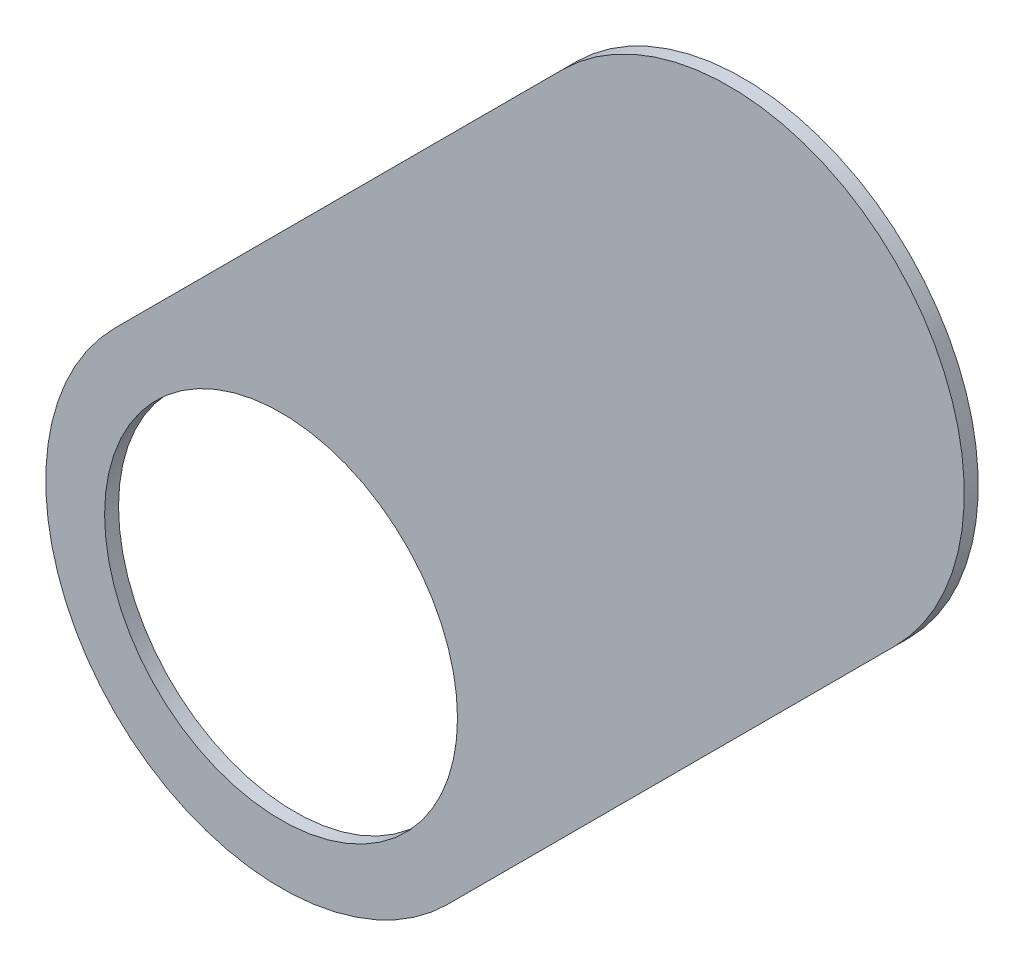
ISO-10303-21;
HEADER;
FILE_DESCRIPTION(('STEP AP214'),'2;1');
FILE_NAME('part.step','',(''),(''),'','','');
FILE_SCHEMA(('AUTOMOTIVE_DESIGN { 1 0 10303 214 1 1 1 1 }'));
ENDSEC;
DATA;
#1=APPLICATION_CONTEXT('core data for automotive mechanical design processes');
#2=APPLICATION_PROTOCOL_DEFINITION('international standard','automotive_design',2000,#1);
#3=PRODUCT_CONTEXT('',#1,'mechanical');
#4=PRODUCT('Part','Part','',(#3));
#5=PRODUCT_RELATED_PRODUCT_CATEGORY('part','',(#4));
#6=PRODUCT_DEFINITION_FORMATION('','',#4);
#7=PRODUCT_DEFINITION_CONTEXT('part definition',#1,'design');
#8=PRODUCT_DEFINITION('design','',#6,#7);
#9=PRODUCT_DEFINITION_SHAPE('','',#8);
#10=(LENGTH_UNIT() NAMED_UNIT(*) SI_UNIT(.MILLI.,.METRE.));
#11=(NAMED_UNIT(*) PLANE_ANGLE_UNIT() SI_UNIT($,.RADIAN.));
#12=(NAMED_UNIT(*) SI_UNIT($,.STERADIAN.) SOLID_ANGLE_UNIT());
#13=UNCERTAINTY_MEASURE_WITH_UNIT(LENGTH_MEASURE(1.E-05),#10,'distance_accuracy_value','');
#14=(GEOMETRIC_REPRESENTATION_CONTEXT(3) GLOBAL_UNCERTAINTY_ASSIGNED_CONTEXT((#13)) GLOBAL_UNIT_ASSIGNED_CONTEXT((#10,
#11,#12)) REPRESENTATION_CONTEXT('',''));
#15=CARTESIAN_POINT('',(0.,0.,0.));
#16=DIRECTION('',(0.,0.,1.));
#17=DIRECTION('',(1.,0.,0.));
#18=AXIS2_PLACEMENT_3D('',#15,#16,#17);
#19=CARTESIAN_POINT('',(106.82425422,45.57574578,0.));
#20=DIRECTION('',(-0.707106781186552,0.707106781186543,0.));
#21=DIRECTION('',(0.707106781186543,0.707106781186552,0.));
#22=AXIS2_PLACEMENT_3D('',#19,#20,#21);
#23=PLANE('',#22);
#24=DIRECTION('',(0.707106781186543,0.707106781186552,0.));
#25=VECTOR('',#24,1.);
#26=CARTESIAN_POINT('',(106.82425422,45.57574578,0.03556));
#27=LINE('',#26,#25);
#28=CARTESIAN_POINT('',(106.82425422,45.57574578,0.03556));
#29=VERTEX_POINT('',#28);
#30=CARTESIAN_POINT('',(107.96664462,46.71813618,0.03556));
#31=VERTEX_POINT('',#30);
#32=EDGE_CURVE('E11',#29,#31,#27,.T.);
#33=ORIENTED_EDGE('',*,*,#32,.F.);
#34=DIRECTION('',(0.,0.,1.));
#35=VECTOR('',#34,1.);
#36=CARTESIAN_POINT('',(106.82425422,45.57574578,0.));
#37=LINE('',#36,#35);
#38=CARTESIAN_POINT('',(106.82425422,45.57574578,0.));
#39=VERTEX_POINT('',#38);
#40=EDGE_CURVE('E24',#39,#29,#37,.T.);
#41=ORIENTED_EDGE('',*,*,#40,.F.);
#42=DIRECTION('',(0.707106781186543,0.707106781186552,0.));
#43=VECTOR('',#42,1.);
#44=CARTESIAN_POINT('',(106.82425422,45.57574578,0.));
#45=LINE('',#44,#43);
#46=CARTESIAN_POINT('',(107.96664462,46.71813618,0.));
#47=VERTEX_POINT('',#46);
#48=EDGE_CURVE('E96',#39,#47,#45,.T.);
#49=ORIENTED_EDGE('',*,*,#48,.T.);
#50=DIRECTION('',(0.,0.,1.));
#51=VECTOR('',#50,1.);
#52=CARTESIAN_POINT('',(107.96664462,46.71813618,0.));
#53=LINE('',#52,#51);
#54=EDGE_CURVE('E37',#47,#31,#53,.T.);
#55=ORIENTED_EDGE('',*,*,#54,.T.);
#56=EDGE_LOOP('',(#33,#41,#49,#55));
#57=FACE_BOUND('',#56,.T.);
#58=ADVANCED_FACE('F17',(#57),#23,.F.);
#59=CARTESIAN_POINT('',(106.3999904,46.0000096,0.));
#60=DIRECTION('',(0.,0.,-1.));
#61=DIRECTION('',(-0.707106781186554,0.707106781186542,0.));
#62=AXIS2_PLACEMENT_3D('',#59,#60,#61);
#63=CYLINDRICAL_SURFACE('',#62,0.599999648268219);
#64=CARTESIAN_POINT('',(106.3999904,46.0000096,0.03556));
#65=DIRECTION('',(0.,0.,1.));
#66=DIRECTION('',(-0.707106781186554,0.707106781186542,0.));
#67=AXIS2_PLACEMENT_3D('',#64,#65,#66);
#68=CIRCLE('',#67,0.599999648268219);
#69=CARTESIAN_POINT('',(105.97572658,46.42427342,0.03556));
#70=VERTEX_POINT('',#69);
#71=EDGE_CURVE('E92',#70,#29,#68,.T.);
#72=ORIENTED_EDGE('',*,*,#71,.F.);
#73=DIRECTION('',(0.,0.,1.));
#74=VECTOR('',#73,1.);
#75=CARTESIAN_POINT('',(105.97572658,46.42427342,0.));
#76=LINE('',#75,#74);
#77=CARTESIAN_POINT('',(105.97572658,46.42427342,0.));
#78=VERTEX_POINT('',#77);
#79=EDGE_CURVE('E90',#78,#70,#76,.T.);
#80=ORIENTED_EDGE('',*,*,#79,.F.);
#81=CARTESIAN_POINT('',(106.3999904,46.0000096,0.));
#82=DIRECTION('',(0.,0.,1.));
#83=DIRECTION('',(-0.707106781186554,0.707106781186542,0.));
#84=AXIS2_PLACEMENT_3D('',#81,#82,#83);
#85=CIRCLE('',#84,0.599999648268219);
#86=EDGE_CURVE('E88',#78,#39,#85,.T.);
#87=ORIENTED_EDGE('',*,*,#86,.T.);
#88=ORIENTED_EDGE('',*,*,#40,.T.);
#89=EDGE_LOOP('',(#72,#80,#87,#88));
#90=FACE_BOUND('',#89,.T.);
#91=ADVANCED_FACE('F111',(#90),#63,.T.);
#92=CARTESIAN_POINT('',(107.5423808,47.1424,0.));
#93=DIRECTION('',(0.,0.,-1.));
#94=DIRECTION('',(0.707106781186542,-0.707106781186554,0.));
#95=AXIS2_PLACEMENT_3D('',#92,#93,#94);
#96=CYLINDRICAL_SURFACE('',#95,0.599999648268213);
#97=CARTESIAN_POINT('',(107.5423808,47.1424,0.03556));
#98=DIRECTION('',(0.,0.,1.));
#99=DIRECTION('',(0.707106781186542,-0.707106781186554,0.));
#100=AXIS2_PLACEMENT_3D('',#97,#98,#99);
#101=CIRCLE('',#100,0.599999648268213);
#102=CARTESIAN_POINT('',(107.11811698,47.56666382,0.03556));
#103=VERTEX_POINT('',#102);
#104=EDGE_CURVE('E85',#31,#103,#101,.T.);
#105=ORIENTED_EDGE('',*,*,#104,.F.);
#106=ORIENTED_EDGE('',*,*,#54,.F.);
#107=CARTESIAN_POINT('',(107.5423808,47.1424,0.));
#108=DIRECTION('',(0.,0.,1.));
#109=DIRECTION('',(0.707106781186542,-0.707106781186554,0.));
#110=AXIS2_PLACEMENT_3D('',#107,#108,#109);
#111=CIRCLE('',#110,0.599999648268213);
#112=CARTESIAN_POINT('',(107.11811698,47.56666382,0.));
#113=VERTEX_POINT('',#112);
#114=EDGE_CURVE('E82',#47,#113,#111,.T.);
#115=ORIENTED_EDGE('',*,*,#114,.T.);
#116=DIRECTION('',(0.,0.,1.));
#117=VECTOR('',#116,1.);
#118=CARTESIAN_POINT('',(107.11811698,47.56666382,0.));
#119=LINE('',#118,#117);
#120=EDGE_CURVE('E80',#113,#103,#119,.T.);
#121=ORIENTED_EDGE('',*,*,#120,.T.);
#122=EDGE_LOOP('',(#105,#106,#115,#121));
#123=FACE_BOUND('',#122,.T.);
#124=ADVANCED_FACE('F104',(#123),#96,.T.);
#125=CARTESIAN_POINT('',(107.11811698,47.56666382,0.));
#126=DIRECTION('',(0.707106781186548,-0.707106781186548,0.));
#127=DIRECTION('',(-0.707106781186548,-0.707106781186548,0.));
#128=AXIS2_PLACEMENT_3D('',#125,#126,#127);
#129=PLANE('',#128);
#130=DIRECTION('',(-0.707106781186548,-0.707106781186548,0.));
#131=VECTOR('',#130,1.);
#132=CARTESIAN_POINT('',(107.11811698,47.56666382,0.03556));
#133=LINE('',#132,#131);
#134=EDGE_CURVE('E77',#103,#70,#133,.T.);
#135=ORIENTED_EDGE('',*,*,#134,.F.);
#136=ORIENTED_EDGE('',*,*,#120,.F.);
#137=DIRECTION('',(-0.707106781186548,-0.707106781186548,0.));
#138=VECTOR('',#137,1.);
#139=CARTESIAN_POINT('',(107.11811698,47.56666382,0.));
#140=LINE('',#139,#138);
#141=EDGE_CURVE('E68',#113,#78,#140,.T.);
#142=ORIENTED_EDGE('',*,*,#141,.T.);
#143=ORIENTED_EDGE('',*,*,#79,.T.);
#144=EDGE_LOOP('',(#135,#136,#142,#143));
#145=FACE_BOUND('',#144,.T.);
#146=ADVANCED_FACE('F110',(#145),#129,.F.);
#147=CARTESIAN_POINT('',(106.3999904,46.0000096,0.));
#148=DIRECTION('',(0.,0.,-1.));
#149=DIRECTION('',(1.,0.,0.));
#150=AXIS2_PLACEMENT_3D('',#147,#148,#149);
#151=CYLINDRICAL_SURFACE('',#150,0.4499991);
#152=DIRECTION('',(0.,0.,1.));
#153=VECTOR('',#152,1.);
#154=CARTESIAN_POINT('',(106.8499895,46.0000096,0.));
#155=LINE('',#154,#153);
#156=CARTESIAN_POINT('',(106.8499895,46.0000096,0.));
#157=VERTEX_POINT('',#156);
#158=CARTESIAN_POINT('',(106.8499895,46.0000096,0.03556));
#159=VERTEX_POINT('',#158);
#160=EDGE_CURVE('E62',#157,#159,#155,.T.);
#161=ORIENTED_EDGE('',*,*,#160,.T.);
#162=CARTESIAN_POINT('',(106.3999904,46.0000096,0.03556));
#163=DIRECTION('',(0.,0.,1.));
#164=DIRECTION('',(1.,0.,0.));
#165=AXIS2_PLACEMENT_3D('',#162,#163,#164);
#166=CIRCLE('',#165,0.4499991);
#167=EDGE_CURVE('E67',#159,#159,#166,.T.);
#168=ORIENTED_EDGE('',*,*,#167,.T.);
#169=ORIENTED_EDGE('',*,*,#160,.F.);
#170=CARTESIAN_POINT('',(106.3999904,46.0000096,0.));
#171=DIRECTION('',(0.,0.,1.));
#172=DIRECTION('',(1.,0.,0.));
#173=AXIS2_PLACEMENT_3D('',#170,#171,#172);
#174=CIRCLE('',#173,0.4499991);
#175=EDGE_CURVE('E65',#157,#157,#174,.T.);
#176=ORIENTED_EDGE('',*,*,#175,.F.);
#177=EDGE_LOOP('',(#161,#168,#169,#176));
#178=FACE_BOUND('',#177,.T.);
#179=ADVANCED_FACE('F64',(#178),#151,.F.);
#180=CARTESIAN_POINT('',(106.82425422,45.57574578,0.));
#181=DIRECTION('',(0.,0.,-1.));
#182=DIRECTION('',(-1.,0.,0.));
#183=AXIS2_PLACEMENT_3D('',#180,#181,#182);
#184=PLANE('',#183);
#185=ORIENTED_EDGE('',*,*,#48,.F.);
#186=ORIENTED_EDGE('',*,*,#86,.F.);
#187=ORIENTED_EDGE('',*,*,#141,.F.);
#188=ORIENTED_EDGE('',*,*,#114,.F.);
#189=EDGE_LOOP('',(#185,#186,#187,#188));
#190=FACE_BOUND('',#189,.T.);
#191=ORIENTED_EDGE('',*,*,#175,.T.);
#192=EDGE_LOOP('',(#191));
#193=FACE_BOUND('',#192,.T.);
#194=ADVANCED_FACE('F71',(#190,#193),#184,.T.);
#195=CARTESIAN_POINT('',(106.82425422,45.57574578,0.03556));
#196=DIRECTION('',(0.,0.,-1.));
#197=DIRECTION('',(-1.,0.,0.));
#198=AXIS2_PLACEMENT_3D('',#195,#196,#197);
#199=PLANE('',#198);
#200=ORIENTED_EDGE('',*,*,#134,.T.);
#201=ORIENTED_EDGE('',*,*,#71,.T.);
#202=ORIENTED_EDGE('',*,*,#32,.T.);
#203=ORIENTED_EDGE('',*,*,#104,.T.);
#204=EDGE_LOOP('',(#200,#201,#202,#203));
#205=FACE_BOUND('',#204,.T.);
#206=ORIENTED_EDGE('',*,*,#167,.F.);
#207=EDGE_LOOP('',(#206));
#208=FACE_BOUND('',#207,.T.);
#209=ADVANCED_FACE('F107',(#205,#208),#199,.F.);
#210=CLOSED_SHELL('',(#58,#91,#124,#146,#179,#194,#209));
#211=MANIFOLD_SOLID_BREP('B1',#210);
#212=ADVANCED_BREP_SHAPE_REPRESENTATION('',(#18,#211),#14);
#213=SHAPE_DEFINITION_REPRESENTATION(#9,#212);
ENDSEC;
END-ISO-10303-21;
